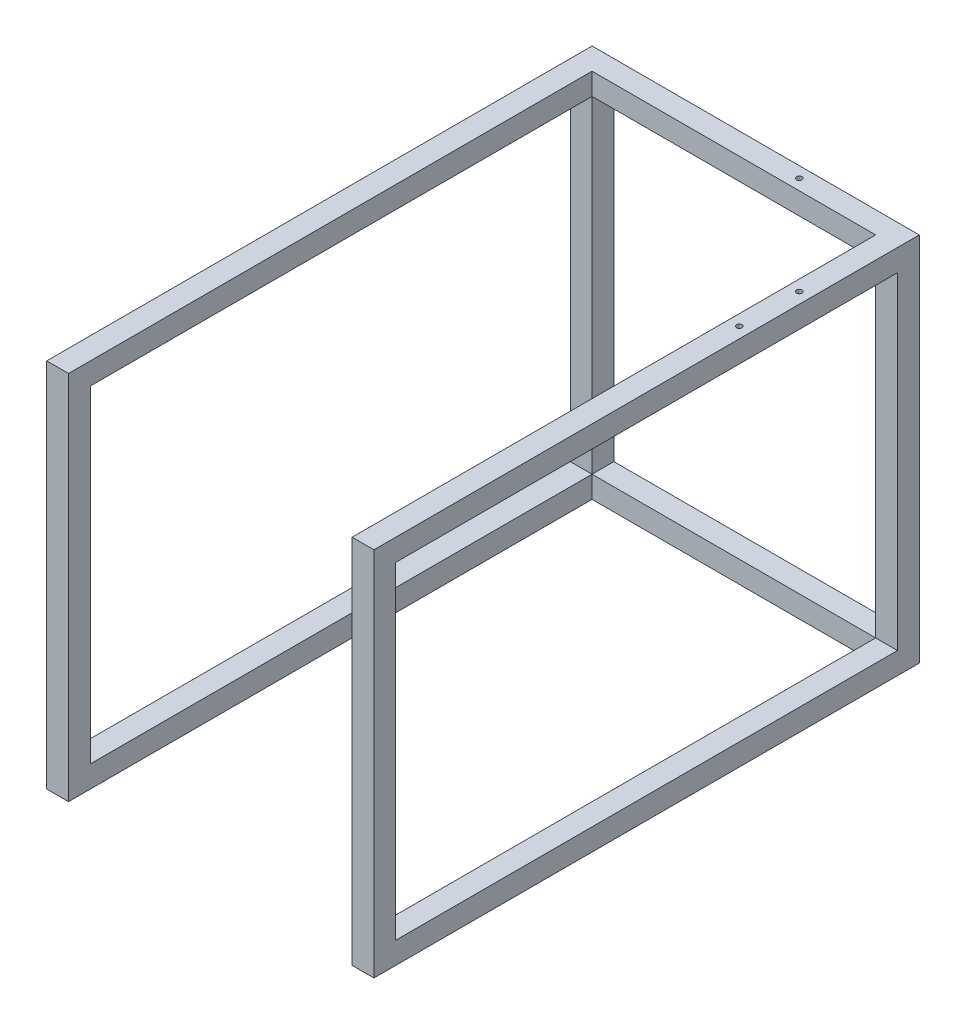
ISO-10303-21;
HEADER;
FILE_DESCRIPTION(('STEP AP214'),'2;1');
FILE_NAME('part.step','',(''),(''),'','','');
FILE_SCHEMA(('AUTOMOTIVE_DESIGN { 1 0 10303 214 1 1 1 1 }'));
ENDSEC;
DATA;
#1=APPLICATION_CONTEXT('core data for automotive mechanical design processes');
#2=APPLICATION_PROTOCOL_DEFINITION('international standard','automotive_design',2000,#1);
#3=PRODUCT_CONTEXT('',#1,'mechanical');
#4=PRODUCT('Part','Part','',(#3));
#5=PRODUCT_RELATED_PRODUCT_CATEGORY('part','',(#4));
#6=PRODUCT_DEFINITION_FORMATION('','',#4);
#7=PRODUCT_DEFINITION_CONTEXT('part definition',#1,'design');
#8=PRODUCT_DEFINITION('design','',#6,#7);
#9=PRODUCT_DEFINITION_SHAPE('','',#8);
#10=(LENGTH_UNIT() NAMED_UNIT(*) SI_UNIT(.MILLI.,.METRE.));
#11=(NAMED_UNIT(*) PLANE_ANGLE_UNIT() SI_UNIT($,.RADIAN.));
#12=(NAMED_UNIT(*) SI_UNIT($,.STERADIAN.) SOLID_ANGLE_UNIT());
#13=UNCERTAINTY_MEASURE_WITH_UNIT(LENGTH_MEASURE(1.E-05),#10,'distance_accuracy_value','');
#14=(GEOMETRIC_REPRESENTATION_CONTEXT(3) GLOBAL_UNCERTAINTY_ASSIGNED_CONTEXT((#13)) GLOBAL_UNIT_ASSIGNED_CONTEXT((#10,
#11,#12)) REPRESENTATION_CONTEXT('',''));
#15=CARTESIAN_POINT('',(0.,0.,0.));
#16=DIRECTION('',(0.,0.,1.));
#17=DIRECTION('',(1.,0.,0.));
#18=AXIS2_PLACEMENT_3D('',#15,#16,#17);
#19=CARTESIAN_POINT('',(0.,100.,0.));
#20=DIRECTION('',(0.,-1.,0.));
#21=DIRECTION('',(-1.,0.,0.));
#22=AXIS2_PLACEMENT_3D('',#19,#20,#21);
#23=PLANE('',#22);
#24=DIRECTION('',(0.,0.,-1.));
#25=VECTOR('',#24,1.);
#26=CARTESIAN_POINT('',(-650.,100.,0.));
#27=LINE('',#26,#25);
#28=CARTESIAN_POINT('',(-650.,100.,-1150.));
#29=VERTEX_POINT('',#28);
#30=CARTESIAN_POINT('',(-650.,100.,-1250.));
#31=VERTEX_POINT('',#30);
#32=EDGE_CURVE('E289',#29,#31,#27,.T.);
#33=ORIENTED_EDGE('',*,*,#32,.F.);
#34=DIRECTION('',(1.,0.,0.));
#35=VECTOR('',#34,1.);
#36=CARTESIAN_POINT('',(750.,100.,-1150.));
#37=LINE('',#36,#35);
#38=CARTESIAN_POINT('',(650.,100.,-1150.));
#39=VERTEX_POINT('',#38);
#40=EDGE_CURVE('E352',#29,#39,#37,.T.);
#41=ORIENTED_EDGE('',*,*,#40,.T.);
#42=DIRECTION('',(0.,0.,-1.));
#43=VECTOR('',#42,1.);
#44=CARTESIAN_POINT('',(650.,100.,0.));
#45=LINE('',#44,#43);
#46=CARTESIAN_POINT('',(650.,100.,-1250.));
#47=VERTEX_POINT('',#46);
#48=EDGE_CURVE('E308',#39,#47,#45,.T.);
#49=ORIENTED_EDGE('',*,*,#48,.T.);
#50=DIRECTION('',(1.,0.,0.));
#51=VECTOR('',#50,1.);
#52=CARTESIAN_POINT('',(750.,100.,-1250.));
#53=LINE('',#52,#51);
#54=EDGE_CURVE('E71',#31,#47,#53,.T.);
#55=ORIENTED_EDGE('',*,*,#54,.F.);
#56=EDGE_LOOP('',(#33,#41,#49,#55));
#57=FACE_BOUND('',#56,.T.);
#58=ADVANCED_FACE('F47',(#57),#23,.F.);
#59=DIRECTION('',(0.,0.,1.));
#60=VECTOR('',#59,1.);
#61=CARTESIAN_POINT('',(650.,100.,-1250.));
#62=LINE('',#61,#60);
#63=CARTESIAN_POINT('',(650.,100.,1150.));
#64=VERTEX_POINT('',#63);
#65=EDGE_CURVE('E336',#39,#64,#62,.T.);
#66=ORIENTED_EDGE('',*,*,#65,.T.);
#67=DIRECTION('',(1.,0.,0.));
#68=VECTOR('',#67,1.);
#69=CARTESIAN_POINT('',(0.,100.,1150.));
#70=LINE('',#69,#68);
#71=CARTESIAN_POINT('',(750.,100.,1150.));
#72=VERTEX_POINT('',#71);
#73=EDGE_CURVE('E258',#64,#72,#70,.T.);
#74=ORIENTED_EDGE('',*,*,#73,.T.);
#75=DIRECTION('',(0.,0.,1.));
#76=VECTOR('',#75,1.);
#77=CARTESIAN_POINT('',(750.,100.,-1250.));
#78=LINE('',#77,#76);
#79=CARTESIAN_POINT('',(750.,100.,-1150.));
#80=VERTEX_POINT('',#79);
#81=EDGE_CURVE('E340',#80,#72,#78,.T.);
#82=ORIENTED_EDGE('',*,*,#81,.F.);
#83=DIRECTION('',(1.,0.,0.));
#84=VECTOR('',#83,1.);
#85=CARTESIAN_POINT('',(0.,100.,-1150.));
#86=LINE('',#85,#84);
#87=EDGE_CURVE('E314',#39,#80,#86,.T.);
#88=ORIENTED_EDGE('',*,*,#87,.F.);
#89=EDGE_LOOP('',(#66,#74,#82,#88));
#90=FACE_BOUND('',#89,.T.);
#91=ADVANCED_FACE('F469',(#90),#23,.F.);
#92=CARTESIAN_POINT('',(650.,100.,-1250.));
#93=DIRECTION('',(1.,0.,0.));
#94=DIRECTION('',(0.,0.,-1.));
#95=AXIS2_PLACEMENT_3D('',#92,#93,#94);
#96=PLANE('',#95);
#97=DIRECTION('',(0.,0.,1.));
#98=VECTOR('',#97,1.);
#99=CARTESIAN_POINT('',(650.,0.,-1250.));
#100=LINE('',#99,#98);
#101=CARTESIAN_POINT('',(650.,0.,-1150.));
#102=VERTEX_POINT('',#101);
#103=CARTESIAN_POINT('',(650.,0.,1250.));
#104=VERTEX_POINT('',#103);
#105=EDGE_CURVE('E335',#102,#104,#100,.T.);
#106=ORIENTED_EDGE('',*,*,#105,.T.);
#107=DIRECTION('',(0.,-1.,0.));
#108=VECTOR('',#107,1.);
#109=CARTESIAN_POINT('',(650.,100.,1250.));
#110=LINE('',#109,#108);
#111=CARTESIAN_POINT('',(650.,1700.,1250.));
#112=VERTEX_POINT('',#111);
#113=EDGE_CURVE('E11',#112,#104,#110,.T.);
#114=ORIENTED_EDGE('',*,*,#113,.F.);
#115=DIRECTION('',(0.,0.,1.));
#116=VECTOR('',#115,1.);
#117=CARTESIAN_POINT('',(650.,1700.,0.));
#118=LINE('',#117,#116);
#119=CARTESIAN_POINT('',(650.,1700.,-1150.));
#120=VERTEX_POINT('',#119);
#121=EDGE_CURVE('E221',#120,#112,#118,.T.);
#122=ORIENTED_EDGE('',*,*,#121,.F.);
#123=DIRECTION('',(0.,-1.,0.));
#124=VECTOR('',#123,1.);
#125=CARTESIAN_POINT('',(650.,1700.,-1150.));
#126=LINE('',#125,#124);
#127=CARTESIAN_POINT('',(650.,1600.,-1150.));
#128=VERTEX_POINT('',#127);
#129=EDGE_CURVE('E230',#120,#128,#126,.T.);
#130=ORIENTED_EDGE('',*,*,#129,.T.);
#131=DIRECTION('',(0.,0.,1.));
#132=VECTOR('',#131,1.);
#133=CARTESIAN_POINT('',(650.,1600.,0.));
#134=LINE('',#133,#132);
#135=CARTESIAN_POINT('',(650.,1600.,1150.));
#136=VERTEX_POINT('',#135);
#137=EDGE_CURVE('E207',#128,#136,#134,.T.);
#138=ORIENTED_EDGE('',*,*,#137,.T.);
#139=DIRECTION('',(0.,-1.,0.));
#140=VECTOR('',#139,1.);
#141=CARTESIAN_POINT('',(650.,1600.,1150.));
#142=LINE('',#141,#140);
#143=EDGE_CURVE('E268',#136,#64,#142,.T.);
#144=ORIENTED_EDGE('',*,*,#143,.T.);
#145=ORIENTED_EDGE('',*,*,#65,.F.);
#146=DIRECTION('',(0.,-1.,0.));
#147=VECTOR('',#146,1.);
#148=CARTESIAN_POINT('',(650.,100.,-1150.));
#149=LINE('',#148,#147);
#150=EDGE_CURVE('E356',#39,#102,#149,.T.);
#151=ORIENTED_EDGE('',*,*,#150,.T.);
#152=EDGE_LOOP('',(#106,#114,#122,#130,#138,#144,#145,#151));
#153=FACE_BOUND('',#152,.T.);
#154=ADVANCED_FACE('F49',(#153),#96,.F.);
#155=CARTESIAN_POINT('',(750.,100.,1250.));
#156=DIRECTION('',(0.,0.,1.));
#157=DIRECTION('',(1.,0.,0.));
#158=AXIS2_PLACEMENT_3D('',#155,#156,#157);
#159=PLANE('',#158);
#160=DIRECTION('',(-1.,0.,0.));
#161=VECTOR('',#160,1.);
#162=CARTESIAN_POINT('',(750.,0.,1250.));
#163=LINE('',#162,#161);
#164=CARTESIAN_POINT('',(750.,0.,1250.));
#165=VERTEX_POINT('',#164);
#166=EDGE_CURVE('E360',#165,#104,#163,.T.);
#167=ORIENTED_EDGE('',*,*,#166,.F.);
#168=DIRECTION('',(0.,-1.,0.));
#169=VECTOR('',#168,1.);
#170=CARTESIAN_POINT('',(750.,100.,1250.));
#171=LINE('',#170,#169);
#172=CARTESIAN_POINT('',(750.,1700.,1250.));
#173=VERTEX_POINT('',#172);
#174=EDGE_CURVE('E56',#173,#165,#171,.T.);
#175=ORIENTED_EDGE('',*,*,#174,.F.);
#176=DIRECTION('',(1.,0.,0.));
#177=VECTOR('',#176,1.);
#178=CARTESIAN_POINT('',(0.,1700.,1250.));
#179=LINE('',#178,#177);
#180=EDGE_CURVE('E225',#112,#173,#179,.T.);
#181=ORIENTED_EDGE('',*,*,#180,.F.);
#182=ORIENTED_EDGE('',*,*,#113,.T.);
#183=EDGE_LOOP('',(#167,#175,#181,#182));
#184=FACE_BOUND('',#183,.T.);
#185=ADVANCED_FACE('F403',(#184),#159,.T.);
#186=CARTESIAN_POINT('',(750.,100.,-1250.));
#187=DIRECTION('',(1.,0.,0.));
#188=DIRECTION('',(0.,0.,-1.));
#189=AXIS2_PLACEMENT_3D('',#186,#187,#188);
#190=PLANE('',#189);
#191=DIRECTION('',(0.,-1.,0.));
#192=VECTOR('',#191,1.);
#193=CARTESIAN_POINT('',(750.,100.,-1250.));
#194=LINE('',#193,#192);
#195=CARTESIAN_POINT('',(750.,1700.,-1250.));
#196=VERTEX_POINT('',#195);
#197=CARTESIAN_POINT('',(750.,0.,-1250.));
#198=VERTEX_POINT('',#197);
#199=EDGE_CURVE('E185',#196,#198,#194,.T.);
#200=ORIENTED_EDGE('',*,*,#199,.F.);
#201=DIRECTION('',(0.,0.,-1.));
#202=VECTOR('',#201,1.);
#203=CARTESIAN_POINT('',(750.000000000001,1700.,-8.32667268468868E-13));
#204=LINE('',#203,#202);
#205=EDGE_CURVE('E201',#173,#196,#204,.T.);
#206=ORIENTED_EDGE('',*,*,#205,.F.);
#207=ORIENTED_EDGE('',*,*,#174,.T.);
#208=DIRECTION('',(0.,0.,1.));
#209=VECTOR('',#208,1.);
#210=CARTESIAN_POINT('',(750.,0.,-1250.));
#211=LINE('',#210,#209);
#212=EDGE_CURVE('E364',#198,#165,#211,.T.);
#213=ORIENTED_EDGE('',*,*,#212,.F.);
#214=EDGE_LOOP('',(#200,#206,#207,#213));
#215=FACE_BOUND('',#214,.T.);
#216=DIRECTION('',(0.,0.,-1.));
#217=VECTOR('',#216,1.);
#218=CARTESIAN_POINT('',(750.000000000001,1600.,-8.32667268468868E-13));
#219=LINE('',#218,#217);
#220=CARTESIAN_POINT('',(750.000000000003,1600.,1150.));
#221=VERTEX_POINT('',#220);
#222=CARTESIAN_POINT('',(750.,1600.,-1150.));
#223=VERTEX_POINT('',#222);
#224=EDGE_CURVE('E203',#221,#223,#219,.T.);
#225=ORIENTED_EDGE('',*,*,#224,.T.);
#226=DIRECTION('',(0.,-1.,0.));
#227=VECTOR('',#226,1.);
#228=CARTESIAN_POINT('',(750.,1600.,-1150.));
#229=LINE('',#228,#227);
#230=EDGE_CURVE('E327',#223,#80,#229,.T.);
#231=ORIENTED_EDGE('',*,*,#230,.T.);
#232=ORIENTED_EDGE('',*,*,#81,.T.);
#233=DIRECTION('',(0.,-1.,0.));
#234=VECTOR('',#233,1.);
#235=CARTESIAN_POINT('',(750.,1600.,1150.));
#236=LINE('',#235,#234);
#237=EDGE_CURVE('E262',#221,#72,#236,.T.);
#238=ORIENTED_EDGE('',*,*,#237,.F.);
#239=EDGE_LOOP('',(#225,#231,#232,#238));
#240=FACE_BOUND('',#239,.T.);
#241=ADVANCED_FACE('F399',(#215,#240),#190,.T.);
#242=CARTESIAN_POINT('',(750.,100.,-1250.));
#243=DIRECTION('',(0.,0.,-1.));
#244=DIRECTION('',(-1.,0.,0.));
#245=AXIS2_PLACEMENT_3D('',#242,#243,#244);
#246=PLANE('',#245);
#247=DIRECTION('',(0.,-1.,0.));
#248=VECTOR('',#247,1.);
#249=CARTESIAN_POINT('',(650.,1600.,-1250.));
#250=LINE('',#249,#248);
#251=CARTESIAN_POINT('',(650.,1600.,-1250.));
#252=VERTEX_POINT('',#251);
#253=EDGE_CURVE('E318',#252,#47,#250,.T.);
#254=ORIENTED_EDGE('',*,*,#253,.F.);
#255=DIRECTION('',(-1.,0.,0.));
#256=VECTOR('',#255,1.);
#257=CARTESIAN_POINT('',(0.,1600.,-1250.));
#258=LINE('',#257,#256);
#259=CARTESIAN_POINT('',(-650.,1600.,-1250.));
#260=VERTEX_POINT('',#259);
#261=EDGE_CURVE('E231',#252,#260,#258,.T.);
#262=ORIENTED_EDGE('',*,*,#261,.T.);
#263=DIRECTION('',(0.,-1.,0.));
#264=VECTOR('',#263,1.);
#265=CARTESIAN_POINT('',(-650.,1600.,-1250.));
#266=LINE('',#265,#264);
#267=EDGE_CURVE('E301',#260,#31,#266,.T.);
#268=ORIENTED_EDGE('',*,*,#267,.T.);
#269=ORIENTED_EDGE('',*,*,#54,.T.);
#270=EDGE_LOOP('',(#254,#262,#268,#269));
#271=FACE_BOUND('',#270,.T.);
#272=DIRECTION('',(1.,0.,0.));
#273=VECTOR('',#272,1.);
#274=CARTESIAN_POINT('',(750.,0.,-1250.));
#275=LINE('',#274,#273);
#276=CARTESIAN_POINT('',(-750.,0.,-1250.));
#277=VERTEX_POINT('',#276);
#278=EDGE_CURVE('E180',#277,#198,#275,.T.);
#279=ORIENTED_EDGE('',*,*,#278,.F.);
#280=DIRECTION('',(0.,-1.,0.));
#281=VECTOR('',#280,1.);
#282=CARTESIAN_POINT('',(-750.,100.,-1250.));
#283=LINE('',#282,#281);
#284=CARTESIAN_POINT('',(-750.,1700.,-1250.));
#285=VERTEX_POINT('',#284);
#286=EDGE_CURVE('E174',#285,#277,#283,.T.);
#287=ORIENTED_EDGE('',*,*,#286,.F.);
#288=DIRECTION('',(-1.,0.,0.));
#289=VECTOR('',#288,1.);
#290=CARTESIAN_POINT('',(0.,1700.,-1250.));
#291=LINE('',#290,#289);
#292=EDGE_CURVE('E178',#196,#285,#291,.T.);
#293=ORIENTED_EDGE('',*,*,#292,.F.);
#294=ORIENTED_EDGE('',*,*,#199,.T.);
#295=EDGE_LOOP('',(#279,#287,#293,#294));
#296=FACE_BOUND('',#295,.T.);
#297=ADVANCED_FACE('F176',(#271,#296),#246,.T.);
#298=CARTESIAN_POINT('',(-750.,100.,-1250.));
#299=DIRECTION('',(-1.,0.,0.));
#300=DIRECTION('',(0.,0.,1.));
#301=AXIS2_PLACEMENT_3D('',#298,#299,#300);
#302=PLANE('',#301);
#303=DIRECTION('',(0.,-1.,0.));
#304=VECTOR('',#303,1.);
#305=CARTESIAN_POINT('',(-750.,1600.,-1150.));
#306=LINE('',#305,#304);
#307=CARTESIAN_POINT('',(-750.,1600.,-1150.));
#308=VERTEX_POINT('',#307);
#309=CARTESIAN_POINT('',(-750.,100.,-1150.));
#310=VERTEX_POINT('',#309);
#311=EDGE_CURVE('E293',#308,#310,#306,.T.);
#312=ORIENTED_EDGE('',*,*,#311,.F.);
#313=DIRECTION('',(0.,0.,1.));
#314=VECTOR('',#313,1.);
#315=CARTESIAN_POINT('',(-750.,1600.,0.));
#316=LINE('',#315,#314);
#317=CARTESIAN_POINT('',(-750.,1600.,1150.));
#318=VERTEX_POINT('',#317);
#319=EDGE_CURVE('E235',#308,#318,#316,.T.);
#320=ORIENTED_EDGE('',*,*,#319,.T.);
#321=DIRECTION('',(0.,-1.,0.));
#322=VECTOR('',#321,1.);
#323=CARTESIAN_POINT('',(-750.,1600.,1150.));
#324=LINE('',#323,#322);
#325=CARTESIAN_POINT('',(-750.,100.,1150.));
#326=VERTEX_POINT('',#325);
#327=EDGE_CURVE('E281',#318,#326,#324,.T.);
#328=ORIENTED_EDGE('',*,*,#327,.T.);
#329=DIRECTION('',(0.,0.,-1.));
#330=VECTOR('',#329,1.);
#331=CARTESIAN_POINT('',(-750.,100.,-1250.));
#332=LINE('',#331,#330);
#333=EDGE_CURVE('E63',#326,#310,#332,.T.);
#334=ORIENTED_EDGE('',*,*,#333,.T.);
#335=EDGE_LOOP('',(#312,#320,#328,#334));
#336=FACE_BOUND('',#335,.T.);
#337=DIRECTION('',(0.,0.,-1.));
#338=VECTOR('',#337,1.);
#339=CARTESIAN_POINT('',(-750.,0.,-1250.));
#340=LINE('',#339,#338);
#341=CARTESIAN_POINT('',(-750.,0.,1250.));
#342=VERTEX_POINT('',#341);
#343=EDGE_CURVE('E370',#342,#277,#340,.T.);
#344=ORIENTED_EDGE('',*,*,#343,.F.);
#345=DIRECTION('',(0.,-1.,0.));
#346=VECTOR('',#345,1.);
#347=CARTESIAN_POINT('',(-750.,100.,1250.));
#348=LINE('',#347,#346);
#349=CARTESIAN_POINT('',(-750.,1700.,1250.));
#350=VERTEX_POINT('',#349);
#351=EDGE_CURVE('E186',#350,#342,#348,.T.);
#352=ORIENTED_EDGE('',*,*,#351,.F.);
#353=DIRECTION('',(0.,0.,1.));
#354=VECTOR('',#353,1.);
#355=CARTESIAN_POINT('',(-750.,1700.,0.));
#356=LINE('',#355,#354);
#357=EDGE_CURVE('E189',#285,#350,#356,.T.);
#358=ORIENTED_EDGE('',*,*,#357,.F.);
#359=ORIENTED_EDGE('',*,*,#286,.T.);
#360=EDGE_LOOP('',(#344,#352,#358,#359));
#361=FACE_BOUND('',#360,.T.);
#362=ADVANCED_FACE('F190',(#336,#361),#302,.T.);
#363=CARTESIAN_POINT('',(-650.,100.,1250.));
#364=DIRECTION('',(0.,0.,1.));
#365=DIRECTION('',(1.,0.,0.));
#366=AXIS2_PLACEMENT_3D('',#363,#364,#365);
#367=PLANE('',#366);
#368=DIRECTION('',(-1.,0.,0.));
#369=VECTOR('',#368,1.);
#370=CARTESIAN_POINT('',(-650.,0.,1250.));
#371=LINE('',#370,#369);
#372=CARTESIAN_POINT('',(-650.,0.,1250.));
#373=VERTEX_POINT('',#372);
#374=EDGE_CURVE('E373',#373,#342,#371,.T.);
#375=ORIENTED_EDGE('',*,*,#374,.F.);
#376=DIRECTION('',(0.,-1.,0.));
#377=VECTOR('',#376,1.);
#378=CARTESIAN_POINT('',(-650.,100.,1250.));
#379=LINE('',#378,#377);
#380=CARTESIAN_POINT('',(-650.,1700.,1250.));
#381=VERTEX_POINT('',#380);
#382=EDGE_CURVE('E389',#381,#373,#379,.T.);
#383=ORIENTED_EDGE('',*,*,#382,.F.);
#384=DIRECTION('',(1.,0.,0.));
#385=VECTOR('',#384,1.);
#386=CARTESIAN_POINT('',(0.,1700.,1250.));
#387=LINE('',#386,#385);
#388=EDGE_CURVE('E195',#350,#381,#387,.T.);
#389=ORIENTED_EDGE('',*,*,#388,.F.);
#390=ORIENTED_EDGE('',*,*,#351,.T.);
#391=EDGE_LOOP('',(#375,#383,#389,#390));
#392=FACE_BOUND('',#391,.T.);
#393=ADVANCED_FACE('F411',(#392),#367,.T.);
#394=CARTESIAN_POINT('',(-650.,100.,-1250.));
#395=DIRECTION('',(-1.,0.,0.));
#396=DIRECTION('',(0.,0.,1.));
#397=AXIS2_PLACEMENT_3D('',#394,#395,#396);
#398=PLANE('',#397);
#399=DIRECTION('',(0.,0.,-1.));
#400=VECTOR('',#399,1.);
#401=CARTESIAN_POINT('',(-650.,0.,-1250.));
#402=LINE('',#401,#400);
#403=CARTESIAN_POINT('',(-650.,0.,-1150.));
#404=VERTEX_POINT('',#403);
#405=EDGE_CURVE('E377',#373,#404,#402,.T.);
#406=ORIENTED_EDGE('',*,*,#405,.T.);
#407=DIRECTION('',(0.,-1.,0.));
#408=VECTOR('',#407,1.);
#409=CARTESIAN_POINT('',(-650.,100.,-1150.));
#410=LINE('',#409,#408);
#411=EDGE_CURVE('E385',#29,#404,#410,.T.);
#412=ORIENTED_EDGE('',*,*,#411,.F.);
#413=DIRECTION('',(0.,0.,-1.));
#414=VECTOR('',#413,1.);
#415=CARTESIAN_POINT('',(-650.,100.,-1250.));
#416=LINE('',#415,#414);
#417=CARTESIAN_POINT('',(-650.,100.,1150.));
#418=VERTEX_POINT('',#417);
#419=EDGE_CURVE('E349',#418,#29,#416,.T.);
#420=ORIENTED_EDGE('',*,*,#419,.F.);
#421=DIRECTION('',(0.,-1.,0.));
#422=VECTOR('',#421,1.);
#423=CARTESIAN_POINT('',(-650.,1600.,1150.));
#424=LINE('',#423,#422);
#425=CARTESIAN_POINT('',(-650.,1600.,1150.));
#426=VERTEX_POINT('',#425);
#427=EDGE_CURVE('E275',#426,#418,#424,.T.);
#428=ORIENTED_EDGE('',*,*,#427,.F.);
#429=DIRECTION('',(0.,0.,-1.));
#430=VECTOR('',#429,1.);
#431=CARTESIAN_POINT('',(-650.,1600.,0.));
#432=LINE('',#431,#430);
#433=CARTESIAN_POINT('',(-650.,1600.,-1150.));
#434=VERTEX_POINT('',#433);
#435=EDGE_CURVE('E240',#426,#434,#432,.T.);
#436=ORIENTED_EDGE('',*,*,#435,.T.);
#437=DIRECTION('',(0.,-1.,0.));
#438=VECTOR('',#437,1.);
#439=CARTESIAN_POINT('',(-650.,1700.,-1150.));
#440=LINE('',#439,#438);
#441=CARTESIAN_POINT('',(-650.,1700.,-1150.));
#442=VERTEX_POINT('',#441);
#443=EDGE_CURVE('E254',#442,#434,#440,.T.);
#444=ORIENTED_EDGE('',*,*,#443,.F.);
#445=DIRECTION('',(0.,0.,-1.));
#446=VECTOR('',#445,1.);
#447=CARTESIAN_POINT('',(-650.,1700.,0.));
#448=LINE('',#447,#446);
#449=EDGE_CURVE('E215',#381,#442,#448,.T.);
#450=ORIENTED_EDGE('',*,*,#449,.F.);
#451=ORIENTED_EDGE('',*,*,#382,.T.);
#452=EDGE_LOOP('',(#406,#412,#420,#428,#436,#444,#450,#451));
#453=FACE_BOUND('',#452,.T.);
#454=ADVANCED_FACE('F415',(#453),#398,.F.);
#455=CARTESIAN_POINT('',(750.,100.,-1150.));
#456=DIRECTION('',(0.,0.,-1.));
#457=DIRECTION('',(-1.,0.,0.));
#458=AXIS2_PLACEMENT_3D('',#455,#456,#457);
#459=PLANE('',#458);
#460=DIRECTION('',(1.,0.,0.));
#461=VECTOR('',#460,1.);
#462=CARTESIAN_POINT('',(750.,0.,-1150.));
#463=LINE('',#462,#461);
#464=EDGE_CURVE('E341',#404,#102,#463,.T.);
#465=ORIENTED_EDGE('',*,*,#464,.T.);
#466=ORIENTED_EDGE('',*,*,#150,.F.);
#467=ORIENTED_EDGE('',*,*,#40,.F.);
#468=ORIENTED_EDGE('',*,*,#411,.T.);
#469=EDGE_LOOP('',(#465,#466,#467,#468));
#470=FACE_BOUND('',#469,.T.);
#471=ADVANCED_FACE('F429',(#470),#459,.F.);
#472=ORIENTED_EDGE('',*,*,#333,.F.);
#473=DIRECTION('',(1.,0.,0.));
#474=VECTOR('',#473,1.);
#475=CARTESIAN_POINT('',(0.,100.,1150.));
#476=LINE('',#475,#474);
#477=EDGE_CURVE('E271',#326,#418,#476,.T.);
#478=ORIENTED_EDGE('',*,*,#477,.T.);
#479=ORIENTED_EDGE('',*,*,#419,.T.);
#480=DIRECTION('',(-1.,0.,0.));
#481=VECTOR('',#480,1.);
#482=CARTESIAN_POINT('',(0.,100.,-1150.));
#483=LINE('',#482,#481);
#484=EDGE_CURVE('E284',#29,#310,#483,.T.);
#485=ORIENTED_EDGE('',*,*,#484,.T.);
#486=EDGE_LOOP('',(#472,#478,#479,#485));
#487=FACE_BOUND('',#486,.T.);
#488=ADVANCED_FACE('F433',(#487),#23,.F.);
#489=CARTESIAN_POINT('',(0.,0.,0.));
#490=DIRECTION('',(0.,-1.,0.));
#491=DIRECTION('',(-1.,0.,0.));
#492=AXIS2_PLACEMENT_3D('',#489,#490,#491);
#493=PLANE('',#492);
#494=ORIENTED_EDGE('',*,*,#105,.F.);
#495=ORIENTED_EDGE('',*,*,#464,.F.);
#496=ORIENTED_EDGE('',*,*,#405,.F.);
#497=ORIENTED_EDGE('',*,*,#374,.T.);
#498=ORIENTED_EDGE('',*,*,#343,.T.);
#499=ORIENTED_EDGE('',*,*,#278,.T.);
#500=ORIENTED_EDGE('',*,*,#212,.T.);
#501=ORIENTED_EDGE('',*,*,#166,.T.);
#502=EDGE_LOOP('',(#494,#495,#496,#497,#498,#499,#500,#501));
#503=FACE_BOUND('',#502,.T.);
#504=ADVANCED_FACE('F406',(#503),#493,.T.);
#505=CARTESIAN_POINT('',(650.,1600.,0.));
#506=DIRECTION('',(-1.,0.,0.));
#507=DIRECTION('',(0.,0.,1.));
#508=AXIS2_PLACEMENT_3D('',#505,#506,#507);
#509=PLANE('',#508);
#510=ORIENTED_EDGE('',*,*,#48,.F.);
#511=DIRECTION('',(0.,-1.,0.));
#512=VECTOR('',#511,1.);
#513=CARTESIAN_POINT('',(650.,1600.,-1150.));
#514=LINE('',#513,#512);
#515=EDGE_CURVE('E331',#128,#39,#514,.T.);
#516=ORIENTED_EDGE('',*,*,#515,.F.);
#517=DIRECTION('',(0.,0.,-1.));
#518=VECTOR('',#517,1.);
#519=CARTESIAN_POINT('',(650.,1600.,0.));
#520=LINE('',#519,#518);
#521=EDGE_CURVE('E309',#128,#252,#520,.T.);
#522=ORIENTED_EDGE('',*,*,#521,.T.);
#523=ORIENTED_EDGE('',*,*,#253,.T.);
#524=EDGE_LOOP('',(#510,#516,#522,#523));
#525=FACE_BOUND('',#524,.T.);
#526=ADVANCED_FACE('F456',(#525),#509,.T.);
#527=CARTESIAN_POINT('',(0.,1600.,-1150.));
#528=DIRECTION('',(0.,0.,-1.));
#529=DIRECTION('',(-1.,0.,0.));
#530=AXIS2_PLACEMENT_3D('',#527,#528,#529);
#531=PLANE('',#530);
#532=ORIENTED_EDGE('',*,*,#87,.T.);
#533=ORIENTED_EDGE('',*,*,#230,.F.);
#534=DIRECTION('',(1.,0.,0.));
#535=VECTOR('',#534,1.);
#536=CARTESIAN_POINT('',(0.,1600.,-1150.));
#537=LINE('',#536,#535);
#538=EDGE_CURVE('E313',#128,#223,#537,.T.);
#539=ORIENTED_EDGE('',*,*,#538,.F.);
#540=ORIENTED_EDGE('',*,*,#515,.T.);
#541=EDGE_LOOP('',(#532,#533,#539,#540));
#542=FACE_BOUND('',#541,.T.);
#543=ADVANCED_FACE('F459',(#542),#531,.F.);
#544=CARTESIAN_POINT('',(0.,1600.,-1150.));
#545=DIRECTION('',(0.,0.,1.));
#546=DIRECTION('',(1.,0.,0.));
#547=AXIS2_PLACEMENT_3D('',#544,#545,#546);
#548=PLANE('',#547);
#549=ORIENTED_EDGE('',*,*,#484,.F.);
#550=DIRECTION('',(0.,-1.,0.));
#551=VECTOR('',#550,1.);
#552=CARTESIAN_POINT('',(-650.,1600.,-1150.));
#553=LINE('',#552,#551);
#554=EDGE_CURVE('E304',#434,#29,#553,.T.);
#555=ORIENTED_EDGE('',*,*,#554,.F.);
#556=DIRECTION('',(-1.,0.,0.));
#557=VECTOR('',#556,1.);
#558=CARTESIAN_POINT('',(0.,1600.,-1150.));
#559=LINE('',#558,#557);
#560=EDGE_CURVE('E285',#434,#308,#559,.T.);
#561=ORIENTED_EDGE('',*,*,#560,.T.);
#562=ORIENTED_EDGE('',*,*,#311,.T.);
#563=EDGE_LOOP('',(#549,#555,#561,#562));
#564=FACE_BOUND('',#563,.T.);
#565=ADVANCED_FACE('F445',(#564),#548,.T.);
#566=CARTESIAN_POINT('',(-650.,1600.,0.));
#567=DIRECTION('',(-1.,0.,0.));
#568=DIRECTION('',(0.,0.,1.));
#569=AXIS2_PLACEMENT_3D('',#566,#567,#568);
#570=PLANE('',#569);
#571=ORIENTED_EDGE('',*,*,#32,.T.);
#572=ORIENTED_EDGE('',*,*,#267,.F.);
#573=DIRECTION('',(0.,0.,-1.));
#574=VECTOR('',#573,1.);
#575=CARTESIAN_POINT('',(-650.,1600.,0.));
#576=LINE('',#575,#574);
#577=EDGE_CURVE('E288',#434,#260,#576,.T.);
#578=ORIENTED_EDGE('',*,*,#577,.F.);
#579=ORIENTED_EDGE('',*,*,#554,.T.);
#580=EDGE_LOOP('',(#571,#572,#578,#579));
#581=FACE_BOUND('',#580,.T.);
#582=ADVANCED_FACE('F449',(#581),#570,.F.);
#583=CARTESIAN_POINT('',(0.,1600.,1150.));
#584=DIRECTION('',(0.,0.,-1.));
#585=DIRECTION('',(-1.,0.,0.));
#586=AXIS2_PLACEMENT_3D('',#583,#584,#585);
#587=PLANE('',#586);
#588=ORIENTED_EDGE('',*,*,#477,.F.);
#589=ORIENTED_EDGE('',*,*,#327,.F.);
#590=DIRECTION('',(1.,0.,0.));
#591=VECTOR('',#590,1.);
#592=CARTESIAN_POINT('',(0.,1600.,1150.));
#593=LINE('',#592,#591);
#594=EDGE_CURVE('E272',#318,#426,#593,.T.);
#595=ORIENTED_EDGE('',*,*,#594,.T.);
#596=ORIENTED_EDGE('',*,*,#427,.T.);
#597=EDGE_LOOP('',(#588,#589,#595,#596));
#598=FACE_BOUND('',#597,.T.);
#599=ADVANCED_FACE('F435',(#598),#587,.T.);
#600=CARTESIAN_POINT('',(0.,1600.,1150.));
#601=DIRECTION('',(0.,0.,-1.));
#602=DIRECTION('',(-1.,0.,0.));
#603=AXIS2_PLACEMENT_3D('',#600,#601,#602);
#604=PLANE('',#603);
#605=ORIENTED_EDGE('',*,*,#73,.F.);
#606=ORIENTED_EDGE('',*,*,#143,.F.);
#607=DIRECTION('',(1.,0.,0.));
#608=VECTOR('',#607,1.);
#609=CARTESIAN_POINT('',(0.,1600.,1150.));
#610=LINE('',#609,#608);
#611=EDGE_CURVE('E259',#136,#221,#610,.T.);
#612=ORIENTED_EDGE('',*,*,#611,.T.);
#613=ORIENTED_EDGE('',*,*,#237,.T.);
#614=EDGE_LOOP('',(#605,#606,#612,#613));
#615=FACE_BOUND('',#614,.T.);
#616=ADVANCED_FACE('F467',(#615),#604,.T.);
#617=CARTESIAN_POINT('',(0.,1600.,0.));
#618=DIRECTION('',(0.,1.,0.));
#619=DIRECTION('',(0.,0.,1.));
#620=AXIS2_PLACEMENT_3D('',#617,#618,#619);
#621=PLANE('',#620);
#622=CARTESIAN_POINT('',(700.,1600.,-475.));
#623=DIRECTION('',(0.,1.,0.));
#624=DIRECTION('',(0.,0.,1.));
#625=AXIS2_PLACEMENT_3D('',#622,#623,#624);
#626=CIRCLE('',#625,12.5);
#627=CARTESIAN_POINT('',(700.,1600.,-462.5));
#628=VERTEX_POINT('',#627);
#629=EDGE_CURVE('E850',#628,#628,#626,.F.);
#630=ORIENTED_EDGE('',*,*,#629,.F.);
#631=EDGE_LOOP('',(#630));
#632=FACE_BOUND('',#631,.T.);
#633=CARTESIAN_POINT('',(700.,1600.,-750.));
#634=DIRECTION('',(0.,1.,0.));
#635=DIRECTION('',(0.,0.,1.));
#636=AXIS2_PLACEMENT_3D('',#633,#634,#635);
#637=CIRCLE('',#636,12.5);
#638=CARTESIAN_POINT('',(700.,1600.,-737.5));
#639=VERTEX_POINT('',#638);
#640=EDGE_CURVE('E210',#639,#639,#637,.F.);
#641=ORIENTED_EDGE('',*,*,#640,.F.);
#642=EDGE_LOOP('',(#641));
#643=FACE_BOUND('',#642,.T.);
#644=ORIENTED_EDGE('',*,*,#137,.F.);
#645=ORIENTED_EDGE('',*,*,#538,.T.);
#646=ORIENTED_EDGE('',*,*,#224,.F.);
#647=ORIENTED_EDGE('',*,*,#611,.F.);
#648=EDGE_LOOP('',(#644,#645,#646,#647));
#649=FACE_BOUND('',#648,.T.);
#650=ADVANCED_FACE('F462',(#632,#643,#649),#621,.F.);
#651=CARTESIAN_POINT('',(250.,1600.,-1200.));
#652=DIRECTION('',(0.,1.,0.));
#653=DIRECTION('',(0.,0.,1.));
#654=AXIS2_PLACEMENT_3D('',#651,#652,#653);
#655=CIRCLE('',#654,12.5);
#656=CARTESIAN_POINT('',(250.,1600.,-1187.5));
#657=VERTEX_POINT('',#656);
#658=EDGE_CURVE('E236',#657,#657,#655,.F.);
#659=ORIENTED_EDGE('',*,*,#658,.F.);
#660=EDGE_LOOP('',(#659));
#661=FACE_BOUND('',#660,.T.);
#662=ORIENTED_EDGE('',*,*,#521,.F.);
#663=DIRECTION('',(1.,0.,0.));
#664=VECTOR('',#663,1.);
#665=CARTESIAN_POINT('',(0.,1600.,-1150.));
#666=LINE('',#665,#664);
#667=EDGE_CURVE('E244',#434,#128,#666,.T.);
#668=ORIENTED_EDGE('',*,*,#667,.F.);
#669=ORIENTED_EDGE('',*,*,#577,.T.);
#670=ORIENTED_EDGE('',*,*,#261,.F.);
#671=EDGE_LOOP('',(#662,#668,#669,#670));
#672=FACE_BOUND('',#671,.T.);
#673=ADVANCED_FACE('F453',(#661,#672),#621,.F.);
#674=CARTESIAN_POINT('',(0.,1700.,-1150.));
#675=DIRECTION('',(0.,0.,-1.));
#676=DIRECTION('',(-1.,0.,0.));
#677=AXIS2_PLACEMENT_3D('',#674,#675,#676);
#678=PLANE('',#677);
#679=ORIENTED_EDGE('',*,*,#667,.T.);
#680=ORIENTED_EDGE('',*,*,#129,.F.);
#681=DIRECTION('',(1.,0.,0.));
#682=VECTOR('',#681,1.);
#683=CARTESIAN_POINT('',(0.,1700.,-1150.));
#684=LINE('',#683,#682);
#685=EDGE_CURVE('E218',#442,#120,#684,.T.);
#686=ORIENTED_EDGE('',*,*,#685,.F.);
#687=ORIENTED_EDGE('',*,*,#443,.T.);
#688=EDGE_LOOP('',(#679,#680,#686,#687));
#689=FACE_BOUND('',#688,.T.);
#690=ADVANCED_FACE('F422',(#689),#678,.F.);
#691=CARTESIAN_POINT('',(0.,1700.,0.));
#692=DIRECTION('',(0.,1.,0.));
#693=DIRECTION('',(0.,0.,1.));
#694=AXIS2_PLACEMENT_3D('',#691,#692,#693);
#695=PLANE('',#694);
#696=CARTESIAN_POINT('',(700.,1700.,-475.));
#697=DIRECTION('',(0.,1.,0.));
#698=DIRECTION('',(0.,0.,1.));
#699=AXIS2_PLACEMENT_3D('',#696,#697,#698);
#700=CIRCLE('',#699,12.5);
#701=CARTESIAN_POINT('',(700.,1700.,-462.5));
#702=VERTEX_POINT('',#701);
#703=EDGE_CURVE('E847',#702,#702,#700,.T.);
#704=ORIENTED_EDGE('',*,*,#703,.F.);
#705=EDGE_LOOP('',(#704));
#706=FACE_BOUND('',#705,.T.);
#707=CARTESIAN_POINT('',(250.,1700.,-1200.));
#708=DIRECTION('',(0.,1.,0.));
#709=DIRECTION('',(0.,0.,1.));
#710=AXIS2_PLACEMENT_3D('',#707,#708,#709);
#711=CIRCLE('',#710,12.5);
#712=CARTESIAN_POINT('',(250.,1700.,-1187.5));
#713=VERTEX_POINT('',#712);
#714=EDGE_CURVE('E859',#713,#713,#711,.T.);
#715=ORIENTED_EDGE('',*,*,#714,.F.);
#716=EDGE_LOOP('',(#715));
#717=FACE_BOUND('',#716,.T.);
#718=CARTESIAN_POINT('',(700.,1700.,-750.));
#719=DIRECTION('',(0.,1.,0.));
#720=DIRECTION('',(0.,0.,1.));
#721=AXIS2_PLACEMENT_3D('',#718,#719,#720);
#722=CIRCLE('',#721,12.5);
#723=CARTESIAN_POINT('',(700.,1700.,-737.5));
#724=VERTEX_POINT('',#723);
#725=EDGE_CURVE('E852',#724,#724,#722,.T.);
#726=ORIENTED_EDGE('',*,*,#725,.F.);
#727=EDGE_LOOP('',(#726));
#728=FACE_BOUND('',#727,.T.);
#729=ORIENTED_EDGE('',*,*,#292,.T.);
#730=ORIENTED_EDGE('',*,*,#357,.T.);
#731=ORIENTED_EDGE('',*,*,#388,.T.);
#732=ORIENTED_EDGE('',*,*,#449,.T.);
#733=ORIENTED_EDGE('',*,*,#685,.T.);
#734=ORIENTED_EDGE('',*,*,#121,.T.);
#735=ORIENTED_EDGE('',*,*,#180,.T.);
#736=ORIENTED_EDGE('',*,*,#205,.T.);
#737=EDGE_LOOP('',(#729,#730,#731,#732,#733,#734,#735,#736));
#738=FACE_BOUND('',#737,.T.);
#739=ADVANCED_FACE('F198',(#706,#717,#728,#738),#695,.T.);
#740=ORIENTED_EDGE('',*,*,#560,.F.);
#741=ORIENTED_EDGE('',*,*,#435,.F.);
#742=ORIENTED_EDGE('',*,*,#594,.F.);
#743=ORIENTED_EDGE('',*,*,#319,.F.);
#744=EDGE_LOOP('',(#740,#741,#742,#743));
#745=FACE_BOUND('',#744,.T.);
#746=ADVANCED_FACE('F440',(#745),#621,.F.);
#747=CARTESIAN_POINT('',(700.,-0.000999999999917733,-750.));
#748=DIRECTION('',(0.,1.,0.));
#749=DIRECTION('',(0.,0.,1.));
#750=AXIS2_PLACEMENT_3D('',#747,#748,#749);
#751=CYLINDRICAL_SURFACE('',#750,12.5);
#752=ORIENTED_EDGE('',*,*,#725,.T.);
#753=EDGE_LOOP('',(#752));
#754=FACE_BOUND('',#753,.T.);
#755=ORIENTED_EDGE('',*,*,#640,.T.);
#756=EDGE_LOOP('',(#755));
#757=FACE_BOUND('',#756,.T.);
#758=ADVANCED_FACE('F671',(#754,#757),#751,.F.);
#759=CARTESIAN_POINT('',(250.,-0.000999999999917733,-1200.));
#760=DIRECTION('',(0.,1.,0.));
#761=DIRECTION('',(0.,0.,1.));
#762=AXIS2_PLACEMENT_3D('',#759,#760,#761);
#763=CYLINDRICAL_SURFACE('',#762,12.5);
#764=ORIENTED_EDGE('',*,*,#714,.T.);
#765=EDGE_LOOP('',(#764));
#766=FACE_BOUND('',#765,.T.);
#767=ORIENTED_EDGE('',*,*,#658,.T.);
#768=EDGE_LOOP('',(#767));
#769=FACE_BOUND('',#768,.T.);
#770=ADVANCED_FACE('F690',(#766,#769),#763,.F.);
#771=CARTESIAN_POINT('',(700.,-0.000999999999917733,-475.));
#772=DIRECTION('',(0.,1.,0.));
#773=DIRECTION('',(0.,0.,1.));
#774=AXIS2_PLACEMENT_3D('',#771,#772,#773);
#775=CYLINDRICAL_SURFACE('',#774,12.5);
#776=ORIENTED_EDGE('',*,*,#703,.T.);
#777=EDGE_LOOP('',(#776));
#778=FACE_BOUND('',#777,.T.);
#779=ORIENTED_EDGE('',*,*,#629,.T.);
#780=EDGE_LOOP('',(#779));
#781=FACE_BOUND('',#780,.T.);
#782=ADVANCED_FACE('F699',(#778,#781),#775,.F.);
#783=CLOSED_SHELL('',(#58,#91,#154,#185,#241,#297,#362,#393,#454,#471,#488,#504,#526,#543,#565,
#582,#599,#616,#650,#673,#690,#739,#746,#758,#770,#782));
#784=MANIFOLD_SOLID_BREP('B2',#783);
#785=ADVANCED_BREP_SHAPE_REPRESENTATION('',(#18,#784),#14);
#786=SHAPE_DEFINITION_REPRESENTATION(#9,#785);
ENDSEC;
END-ISO-10303-21;
